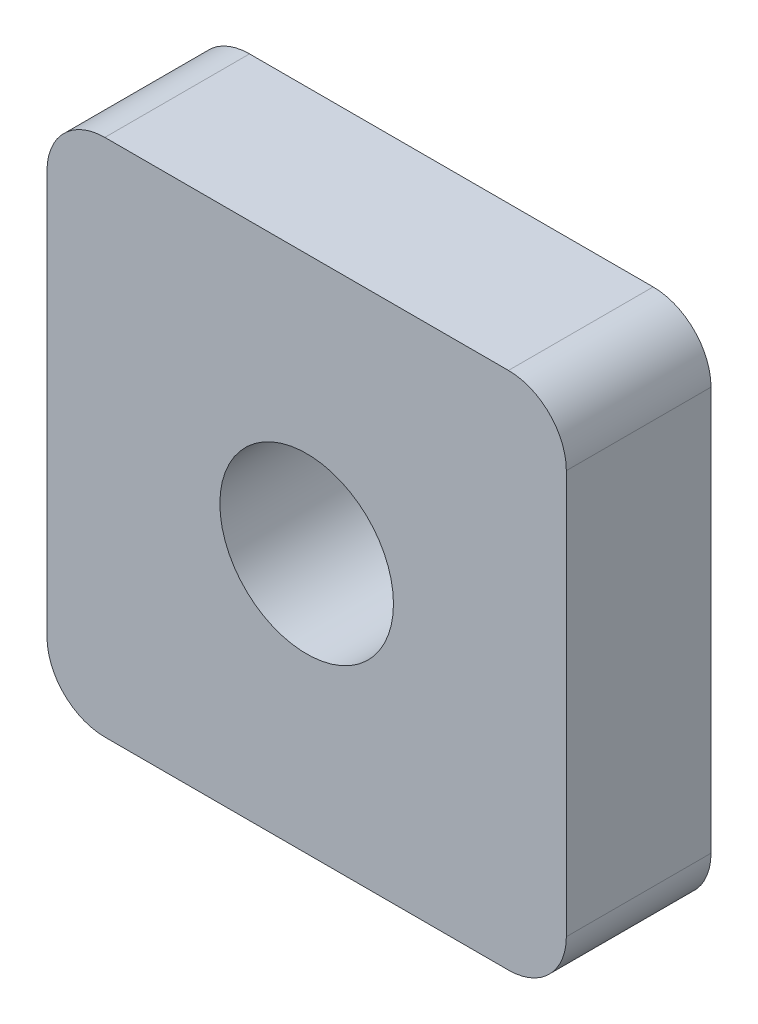
ISO-10303-21;
HEADER;
FILE_DESCRIPTION(('STEP AP214'),'2;1');
FILE_NAME('part.step','',(''),(''),'','','');
FILE_SCHEMA(('AUTOMOTIVE_DESIGN { 1 0 10303 214 1 1 1 1 }'));
ENDSEC;
DATA;
#1=APPLICATION_CONTEXT('core data for automotive mechanical design processes');
#2=APPLICATION_PROTOCOL_DEFINITION('international standard','automotive_design',2000,#1);
#3=PRODUCT_CONTEXT('',#1,'mechanical');
#4=PRODUCT('Part','Part','',(#3));
#5=PRODUCT_RELATED_PRODUCT_CATEGORY('part','',(#4));
#6=PRODUCT_DEFINITION_FORMATION('','',#4);
#7=PRODUCT_DEFINITION_CONTEXT('part definition',#1,'design');
#8=PRODUCT_DEFINITION('design','',#6,#7);
#9=PRODUCT_DEFINITION_SHAPE('','',#8);
#10=(LENGTH_UNIT() NAMED_UNIT(*) SI_UNIT(.MILLI.,.METRE.));
#11=(NAMED_UNIT(*) PLANE_ANGLE_UNIT() SI_UNIT($,.RADIAN.));
#12=(NAMED_UNIT(*) SI_UNIT($,.STERADIAN.) SOLID_ANGLE_UNIT());
#13=UNCERTAINTY_MEASURE_WITH_UNIT(LENGTH_MEASURE(1.E-05),#10,'distance_accuracy_value','');
#14=(GEOMETRIC_REPRESENTATION_CONTEXT(3) GLOBAL_UNCERTAINTY_ASSIGNED_CONTEXT((#13)) GLOBAL_UNIT_ASSIGNED_CONTEXT((#10,
#11,#12)) REPRESENTATION_CONTEXT('',''));
#15=CARTESIAN_POINT('',(0.,0.,0.));
#16=DIRECTION('',(0.,0.,1.));
#17=DIRECTION('',(1.,0.,0.));
#18=AXIS2_PLACEMENT_3D('',#15,#16,#17);
#19=CARTESIAN_POINT('',(0.,0.,5.));
#20=DIRECTION('',(0.,0.,-1.));
#21=DIRECTION('',(-1.,0.,0.));
#22=AXIS2_PLACEMENT_3D('',#19,#20,#21);
#23=PLANE('',#22);
#24=DIRECTION('',(1.,0.,0.));
#25=VECTOR('',#24,1.);
#26=CARTESIAN_POINT('',(-8.975,-8.975,5.));
#27=LINE('',#26,#25);
#28=CARTESIAN_POINT('',(-6.975,-8.975,5.));
#29=VERTEX_POINT('',#28);
#30=CARTESIAN_POINT('',(6.975,-8.975,5.));
#31=VERTEX_POINT('',#30);
#32=EDGE_CURVE('E139',#29,#31,#27,.T.);
#33=ORIENTED_EDGE('',*,*,#32,.T.);
#34=CARTESIAN_POINT('',(6.975,-6.975,5.));
#35=DIRECTION('',(0.,0.,-1.));
#36=DIRECTION('',(-1.,0.,0.));
#37=AXIS2_PLACEMENT_3D('',#34,#35,#36);
#38=CIRCLE('',#37,2.);
#39=CARTESIAN_POINT('',(8.975,-6.975,5.));
#40=VERTEX_POINT('',#39);
#41=EDGE_CURVE('E158',#31,#40,#38,.F.);
#42=ORIENTED_EDGE('',*,*,#41,.T.);
#43=DIRECTION('',(0.,1.,0.));
#44=VECTOR('',#43,1.);
#45=CARTESIAN_POINT('',(8.975,-8.975,5.));
#46=LINE('',#45,#44);
#47=CARTESIAN_POINT('',(8.975,6.975,5.));
#48=VERTEX_POINT('',#47);
#49=EDGE_CURVE('E122',#40,#48,#46,.T.);
#50=ORIENTED_EDGE('',*,*,#49,.T.);
#51=CARTESIAN_POINT('',(6.975,6.975,5.));
#52=DIRECTION('',(0.,0.,-1.));
#53=DIRECTION('',(-1.,0.,0.));
#54=AXIS2_PLACEMENT_3D('',#51,#52,#53);
#55=CIRCLE('',#54,2.);
#56=CARTESIAN_POINT('',(6.975,8.975,5.));
#57=VERTEX_POINT('',#56);
#58=EDGE_CURVE('E153',#48,#57,#55,.F.);
#59=ORIENTED_EDGE('',*,*,#58,.T.);
#60=DIRECTION('',(-1.,0.,0.));
#61=VECTOR('',#60,1.);
#62=CARTESIAN_POINT('',(-8.975,8.975,5.));
#63=LINE('',#62,#61);
#64=CARTESIAN_POINT('',(-6.975,8.975,5.));
#65=VERTEX_POINT('',#64);
#66=EDGE_CURVE('E169',#57,#65,#63,.T.);
#67=ORIENTED_EDGE('',*,*,#66,.T.);
#68=CARTESIAN_POINT('',(-6.975,6.975,5.));
#69=DIRECTION('',(0.,0.,-1.));
#70=DIRECTION('',(-1.,0.,0.));
#71=AXIS2_PLACEMENT_3D('',#68,#69,#70);
#72=CIRCLE('',#71,2.);
#73=CARTESIAN_POINT('',(-8.975,6.975,5.));
#74=VERTEX_POINT('',#73);
#75=EDGE_CURVE('E58',#65,#74,#72,.F.);
#76=ORIENTED_EDGE('',*,*,#75,.T.);
#77=DIRECTION('',(0.,-1.,0.));
#78=VECTOR('',#77,1.);
#79=CARTESIAN_POINT('',(-8.975,-8.975,5.));
#80=LINE('',#79,#78);
#81=CARTESIAN_POINT('',(-8.975,-6.975,5.));
#82=VERTEX_POINT('',#81);
#83=EDGE_CURVE('E177',#74,#82,#80,.T.);
#84=ORIENTED_EDGE('',*,*,#83,.T.);
#85=CARTESIAN_POINT('',(-6.975,-6.975,5.));
#86=DIRECTION('',(0.,0.,-1.));
#87=DIRECTION('',(-1.,0.,0.));
#88=AXIS2_PLACEMENT_3D('',#85,#86,#87);
#89=CIRCLE('',#88,2.);
#90=EDGE_CURVE('E156',#82,#29,#89,.F.);
#91=ORIENTED_EDGE('',*,*,#90,.T.);
#92=EDGE_LOOP('',(#33,#42,#50,#59,#67,#76,#84,#91));
#93=FACE_BOUND('',#92,.T.);
#94=CARTESIAN_POINT('',(0.,0.,5.));
#95=DIRECTION('',(0.,0.,1.));
#96=DIRECTION('',(1.,0.,0.));
#97=AXIS2_PLACEMENT_3D('',#94,#95,#96);
#98=CIRCLE('',#97,3.);
#99=CARTESIAN_POINT('',(3.,0.,5.));
#100=VERTEX_POINT('',#99);
#101=EDGE_CURVE('E130',#100,#100,#98,.T.);
#102=ORIENTED_EDGE('',*,*,#101,.F.);
#103=EDGE_LOOP('',(#102));
#104=FACE_BOUND('',#103,.T.);
#105=ADVANCED_FACE('F36',(#93,#104),#23,.F.);
#106=CARTESIAN_POINT('',(0.,0.,0.));
#107=DIRECTION('',(0.,0.,-1.));
#108=DIRECTION('',(-1.,0.,0.));
#109=AXIS2_PLACEMENT_3D('',#106,#107,#108);
#110=PLANE('',#109);
#111=DIRECTION('',(0.,1.,0.));
#112=VECTOR('',#111,1.);
#113=CARTESIAN_POINT('',(8.975,-8.975,0.));
#114=LINE('',#113,#112);
#115=CARTESIAN_POINT('',(8.975,-6.975,0.));
#116=VERTEX_POINT('',#115);
#117=CARTESIAN_POINT('',(8.975,6.975,0.));
#118=VERTEX_POINT('',#117);
#119=EDGE_CURVE('E119',#116,#118,#114,.T.);
#120=ORIENTED_EDGE('',*,*,#119,.F.);
#121=CARTESIAN_POINT('',(6.975,-6.975,0.));
#122=DIRECTION('',(0.,0.,-1.));
#123=DIRECTION('',(-1.,0.,0.));
#124=AXIS2_PLACEMENT_3D('',#121,#122,#123);
#125=CIRCLE('',#124,2.);
#126=CARTESIAN_POINT('',(6.975,-8.975,0.));
#127=VERTEX_POINT('',#126);
#128=EDGE_CURVE('E102',#116,#127,#125,.T.);
#129=ORIENTED_EDGE('',*,*,#128,.T.);
#130=DIRECTION('',(1.,0.,0.));
#131=VECTOR('',#130,1.);
#132=CARTESIAN_POINT('',(-8.975,-8.975,0.));
#133=LINE('',#132,#131);
#134=CARTESIAN_POINT('',(-6.975,-8.975,0.));
#135=VERTEX_POINT('',#134);
#136=EDGE_CURVE('E143',#135,#127,#133,.T.);
#137=ORIENTED_EDGE('',*,*,#136,.F.);
#138=CARTESIAN_POINT('',(-6.975,-6.975,0.));
#139=DIRECTION('',(0.,0.,-1.));
#140=DIRECTION('',(-1.,0.,0.));
#141=AXIS2_PLACEMENT_3D('',#138,#139,#140);
#142=CIRCLE('',#141,2.);
#143=CARTESIAN_POINT('',(-8.975,-6.975,0.));
#144=VERTEX_POINT('',#143);
#145=EDGE_CURVE('E113',#135,#144,#142,.T.);
#146=ORIENTED_EDGE('',*,*,#145,.T.);
#147=DIRECTION('',(0.,-1.,0.));
#148=VECTOR('',#147,1.);
#149=CARTESIAN_POINT('',(-8.975,-8.975,0.));
#150=LINE('',#149,#148);
#151=CARTESIAN_POINT('',(-8.975,6.975,0.));
#152=VERTEX_POINT('',#151);
#153=EDGE_CURVE('E133',#152,#144,#150,.T.);
#154=ORIENTED_EDGE('',*,*,#153,.F.);
#155=CARTESIAN_POINT('',(-6.975,6.975,0.));
#156=DIRECTION('',(0.,0.,-1.));
#157=DIRECTION('',(-1.,0.,0.));
#158=AXIS2_PLACEMENT_3D('',#155,#156,#157);
#159=CIRCLE('',#158,2.);
#160=CARTESIAN_POINT('',(-6.975,8.975,0.));
#161=VERTEX_POINT('',#160);
#162=EDGE_CURVE('E147',#152,#161,#159,.T.);
#163=ORIENTED_EDGE('',*,*,#162,.T.);
#164=DIRECTION('',(-1.,0.,0.));
#165=VECTOR('',#164,1.);
#166=CARTESIAN_POINT('',(-8.975,8.975,0.));
#167=LINE('',#166,#165);
#168=CARTESIAN_POINT('',(6.975,8.975,0.));
#169=VERTEX_POINT('',#168);
#170=EDGE_CURVE('E129',#169,#161,#167,.T.);
#171=ORIENTED_EDGE('',*,*,#170,.F.);
#172=CARTESIAN_POINT('',(6.975,6.975,0.));
#173=DIRECTION('',(0.,0.,-1.));
#174=DIRECTION('',(-1.,0.,0.));
#175=AXIS2_PLACEMENT_3D('',#172,#173,#174);
#176=CIRCLE('',#175,2.);
#177=EDGE_CURVE('E123',#169,#118,#176,.T.);
#178=ORIENTED_EDGE('',*,*,#177,.T.);
#179=EDGE_LOOP('',(#120,#129,#137,#146,#154,#163,#171,#178));
#180=FACE_BOUND('',#179,.T.);
#181=CARTESIAN_POINT('',(0.,0.,0.));
#182=DIRECTION('',(0.,0.,1.));
#183=DIRECTION('',(1.,0.,0.));
#184=AXIS2_PLACEMENT_3D('',#181,#182,#183);
#185=CIRCLE('',#184,3.);
#186=CARTESIAN_POINT('',(3.,0.,0.));
#187=VERTEX_POINT('',#186);
#188=EDGE_CURVE('E136',#187,#187,#185,.T.);
#189=ORIENTED_EDGE('',*,*,#188,.T.);
#190=EDGE_LOOP('',(#189));
#191=FACE_BOUND('',#190,.T.);
#192=ADVANCED_FACE('F126',(#180,#191),#110,.T.);
#193=CARTESIAN_POINT('',(8.975,-8.975,5.));
#194=DIRECTION('',(-1.,0.,0.));
#195=DIRECTION('',(0.,0.,1.));
#196=AXIS2_PLACEMENT_3D('',#193,#194,#195);
#197=PLANE('',#196);
#198=ORIENTED_EDGE('',*,*,#49,.F.);
#199=DIRECTION('',(0.,0.,-1.));
#200=VECTOR('',#199,1.);
#201=CARTESIAN_POINT('',(8.975,-6.975,5.));
#202=LINE('',#201,#200);
#203=EDGE_CURVE('E106',#40,#116,#202,.T.);
#204=ORIENTED_EDGE('',*,*,#203,.T.);
#205=ORIENTED_EDGE('',*,*,#119,.T.);
#206=DIRECTION('',(0.,0.,-1.));
#207=VECTOR('',#206,1.);
#208=CARTESIAN_POINT('',(8.975,6.975,5.));
#209=LINE('',#208,#207);
#210=EDGE_CURVE('E124',#118,#48,#209,.F.);
#211=ORIENTED_EDGE('',*,*,#210,.T.);
#212=EDGE_LOOP('',(#198,#204,#205,#211));
#213=FACE_BOUND('',#212,.T.);
#214=ADVANCED_FACE('F118',(#213),#197,.F.);
#215=CARTESIAN_POINT('',(-8.975,8.975,5.));
#216=DIRECTION('',(0.,-1.,0.));
#217=DIRECTION('',(0.,0.,-1.));
#218=AXIS2_PLACEMENT_3D('',#215,#216,#217);
#219=PLANE('',#218);
#220=ORIENTED_EDGE('',*,*,#170,.T.);
#221=DIRECTION('',(0.,0.,-1.));
#222=VECTOR('',#221,1.);
#223=CARTESIAN_POINT('',(-6.975,8.975,5.));
#224=LINE('',#223,#222);
#225=EDGE_CURVE('E11',#161,#65,#224,.F.);
#226=ORIENTED_EDGE('',*,*,#225,.T.);
#227=ORIENTED_EDGE('',*,*,#66,.F.);
#228=DIRECTION('',(0.,0.,-1.));
#229=VECTOR('',#228,1.);
#230=CARTESIAN_POINT('',(6.975,8.975,5.));
#231=LINE('',#230,#229);
#232=EDGE_CURVE('E44',#57,#169,#231,.T.);
#233=ORIENTED_EDGE('',*,*,#232,.T.);
#234=EDGE_LOOP('',(#220,#226,#227,#233));
#235=FACE_BOUND('',#234,.T.);
#236=ADVANCED_FACE('F167',(#235),#219,.F.);
#237=CARTESIAN_POINT('',(-8.975,-8.975,5.));
#238=DIRECTION('',(1.,0.,0.));
#239=DIRECTION('',(0.,0.,-1.));
#240=AXIS2_PLACEMENT_3D('',#237,#238,#239);
#241=PLANE('',#240);
#242=ORIENTED_EDGE('',*,*,#153,.T.);
#243=DIRECTION('',(0.,0.,-1.));
#244=VECTOR('',#243,1.);
#245=CARTESIAN_POINT('',(-8.975,-6.975,5.));
#246=LINE('',#245,#244);
#247=EDGE_CURVE('E51',#144,#82,#246,.F.);
#248=ORIENTED_EDGE('',*,*,#247,.T.);
#249=ORIENTED_EDGE('',*,*,#83,.F.);
#250=DIRECTION('',(0.,0.,-1.));
#251=VECTOR('',#250,1.);
#252=CARTESIAN_POINT('',(-8.975,6.975,5.));
#253=LINE('',#252,#251);
#254=EDGE_CURVE('E160',#74,#152,#253,.T.);
#255=ORIENTED_EDGE('',*,*,#254,.T.);
#256=EDGE_LOOP('',(#242,#248,#249,#255));
#257=FACE_BOUND('',#256,.T.);
#258=ADVANCED_FACE('F176',(#257),#241,.F.);
#259=CARTESIAN_POINT('',(-8.975,-8.975,5.));
#260=DIRECTION('',(0.,1.,0.));
#261=DIRECTION('',(0.,0.,1.));
#262=AXIS2_PLACEMENT_3D('',#259,#260,#261);
#263=PLANE('',#262);
#264=ORIENTED_EDGE('',*,*,#136,.T.);
#265=DIRECTION('',(0.,0.,-1.));
#266=VECTOR('',#265,1.);
#267=CARTESIAN_POINT('',(6.975,-8.975,5.));
#268=LINE('',#267,#266);
#269=EDGE_CURVE('E107',#127,#31,#268,.F.);
#270=ORIENTED_EDGE('',*,*,#269,.T.);
#271=ORIENTED_EDGE('',*,*,#32,.F.);
#272=DIRECTION('',(0.,0.,-1.));
#273=VECTOR('',#272,1.);
#274=CARTESIAN_POINT('',(-6.975,-8.975,5.));
#275=LINE('',#274,#273);
#276=EDGE_CURVE('E112',#29,#135,#275,.T.);
#277=ORIENTED_EDGE('',*,*,#276,.T.);
#278=EDGE_LOOP('',(#264,#270,#271,#277));
#279=FACE_BOUND('',#278,.T.);
#280=ADVANCED_FACE('F188',(#279),#263,.F.);
#281=CARTESIAN_POINT('',(0.,0.,5.));
#282=DIRECTION('',(0.,0.,-1.));
#283=DIRECTION('',(-1.,0.,0.));
#284=AXIS2_PLACEMENT_3D('',#281,#282,#283);
#285=CYLINDRICAL_SURFACE('',#284,3.);
#286=ORIENTED_EDGE('',*,*,#101,.T.);
#287=EDGE_LOOP('',(#286));
#288=FACE_BOUND('',#287,.T.);
#289=ORIENTED_EDGE('',*,*,#188,.F.);
#290=EDGE_LOOP('',(#289));
#291=FACE_BOUND('',#290,.T.);
#292=ADVANCED_FACE('F186',(#288,#291),#285,.F.);
#293=CARTESIAN_POINT('',(6.975,-6.975,5.));
#294=DIRECTION('',(0.,0.,-1.));
#295=DIRECTION('',(-1.,0.,0.));
#296=AXIS2_PLACEMENT_3D('',#293,#294,#295);
#297=CYLINDRICAL_SURFACE('',#296,2.);
#298=ORIENTED_EDGE('',*,*,#41,.F.);
#299=ORIENTED_EDGE('',*,*,#269,.F.);
#300=ORIENTED_EDGE('',*,*,#128,.F.);
#301=ORIENTED_EDGE('',*,*,#203,.F.);
#302=EDGE_LOOP('',(#298,#299,#300,#301));
#303=FACE_BOUND('',#302,.T.);
#304=ADVANCED_FACE('F105',(#303),#297,.T.);
#305=CARTESIAN_POINT('',(-6.975,-6.975,5.));
#306=DIRECTION('',(0.,0.,-1.));
#307=DIRECTION('',(-1.,0.,0.));
#308=AXIS2_PLACEMENT_3D('',#305,#306,#307);
#309=CYLINDRICAL_SURFACE('',#308,2.);
#310=ORIENTED_EDGE('',*,*,#90,.F.);
#311=ORIENTED_EDGE('',*,*,#247,.F.);
#312=ORIENTED_EDGE('',*,*,#145,.F.);
#313=ORIENTED_EDGE('',*,*,#276,.F.);
#314=EDGE_LOOP('',(#310,#311,#312,#313));
#315=FACE_BOUND('',#314,.T.);
#316=ADVANCED_FACE('F195',(#315),#309,.T.);
#317=CARTESIAN_POINT('',(-6.975,6.975,5.));
#318=DIRECTION('',(0.,0.,-1.));
#319=DIRECTION('',(-1.,0.,0.));
#320=AXIS2_PLACEMENT_3D('',#317,#318,#319);
#321=CYLINDRICAL_SURFACE('',#320,2.);
#322=ORIENTED_EDGE('',*,*,#75,.F.);
#323=ORIENTED_EDGE('',*,*,#225,.F.);
#324=ORIENTED_EDGE('',*,*,#162,.F.);
#325=ORIENTED_EDGE('',*,*,#254,.F.);
#326=EDGE_LOOP('',(#322,#323,#324,#325));
#327=FACE_BOUND('',#326,.T.);
#328=ADVANCED_FACE('F175',(#327),#321,.T.);
#329=CARTESIAN_POINT('',(6.975,6.975,5.));
#330=DIRECTION('',(0.,0.,-1.));
#331=DIRECTION('',(-1.,0.,0.));
#332=AXIS2_PLACEMENT_3D('',#329,#330,#331);
#333=CYLINDRICAL_SURFACE('',#332,2.);
#334=ORIENTED_EDGE('',*,*,#58,.F.);
#335=ORIENTED_EDGE('',*,*,#210,.F.);
#336=ORIENTED_EDGE('',*,*,#177,.F.);
#337=ORIENTED_EDGE('',*,*,#232,.F.);
#338=EDGE_LOOP('',(#334,#335,#336,#337));
#339=FACE_BOUND('',#338,.T.);
#340=ADVANCED_FACE('F38',(#339),#333,.T.);
#341=CLOSED_SHELL('',(#105,#192,#214,#236,#258,#280,#292,#304,#316,#328,#340));
#342=MANIFOLD_SOLID_BREP('B2',#341);
#343=ADVANCED_BREP_SHAPE_REPRESENTATION('',(#18,#342),#14);
#344=SHAPE_DEFINITION_REPRESENTATION(#9,#343);
ENDSEC;
END-ISO-10303-21;
